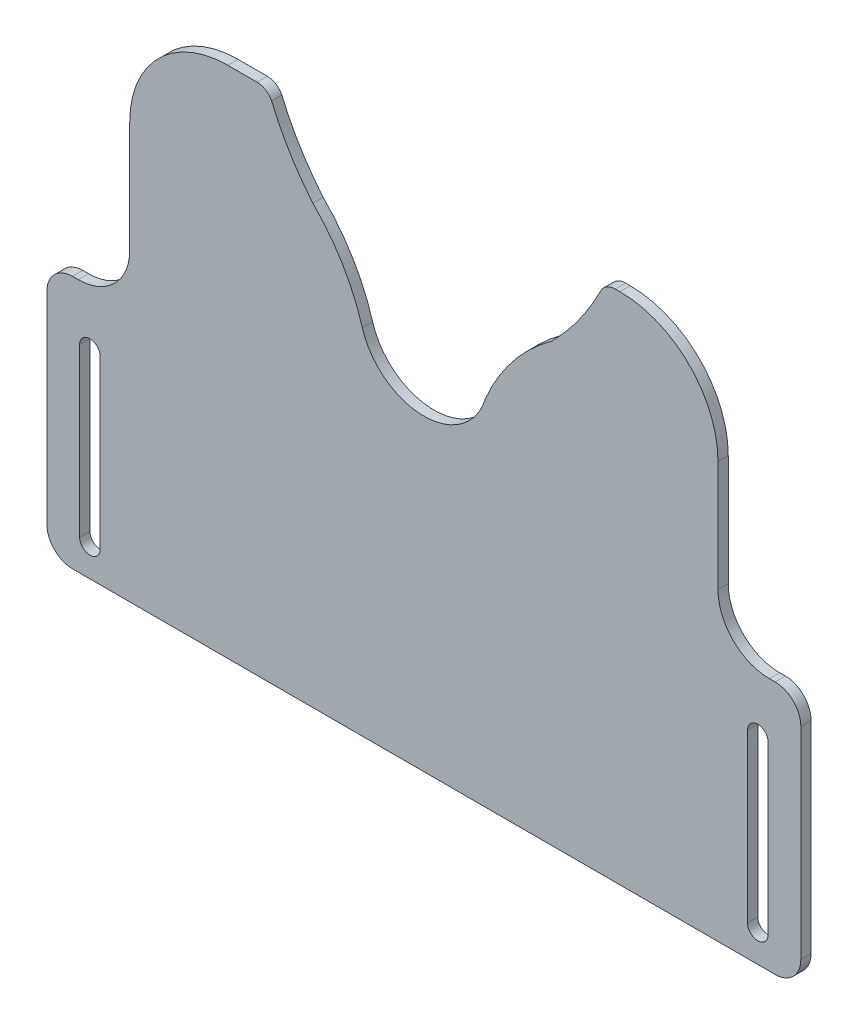
ISO-10303-21;
HEADER;
FILE_DESCRIPTION(('STEP AP214'),'2;1');
FILE_NAME('part.step','',(''),(''),'','','');
FILE_SCHEMA(('AUTOMOTIVE_DESIGN { 1 0 10303 214 1 1 1 1 }'));
ENDSEC;
DATA;
#1=APPLICATION_CONTEXT('core data for automotive mechanical design processes');
#2=APPLICATION_PROTOCOL_DEFINITION('international standard','automotive_design',2000,#1);
#3=PRODUCT_CONTEXT('',#1,'mechanical');
#4=PRODUCT('Part','Part','',(#3));
#5=PRODUCT_RELATED_PRODUCT_CATEGORY('part','',(#4));
#6=PRODUCT_DEFINITION_FORMATION('','',#4);
#7=PRODUCT_DEFINITION_CONTEXT('part definition',#1,'design');
#8=PRODUCT_DEFINITION('design','',#6,#7);
#9=PRODUCT_DEFINITION_SHAPE('','',#8);
#10=(LENGTH_UNIT() NAMED_UNIT(*) SI_UNIT(.MILLI.,.METRE.));
#11=(NAMED_UNIT(*) PLANE_ANGLE_UNIT() SI_UNIT($,.RADIAN.));
#12=(NAMED_UNIT(*) SI_UNIT($,.STERADIAN.) SOLID_ANGLE_UNIT());
#13=UNCERTAINTY_MEASURE_WITH_UNIT(LENGTH_MEASURE(1.E-05),#10,'distance_accuracy_value','');
#14=(GEOMETRIC_REPRESENTATION_CONTEXT(3) GLOBAL_UNCERTAINTY_ASSIGNED_CONTEXT((#13)) GLOBAL_UNIT_ASSIGNED_CONTEXT((#10,
#11,#12)) REPRESENTATION_CONTEXT('',''));
#15=CARTESIAN_POINT('',(0.,0.,0.));
#16=DIRECTION('',(0.,0.,1.));
#17=DIRECTION('',(1.,0.,0.));
#18=AXIS2_PLACEMENT_3D('',#15,#16,#17);
#19=CARTESIAN_POINT('',(76.3333289832106,155.198889476935,4.));
#20=DIRECTION('',(0.,0.,-1.));
#21=DIRECTION('',(-1.,0.,0.));
#22=AXIS2_PLACEMENT_3D('',#19,#20,#21);
#23=CYLINDRICAL_SURFACE('',#22,38.1666666666667);
#24=CARTESIAN_POINT('',(76.3333289832106,155.198889476935,0.));
#25=DIRECTION('',(0.,0.,1.));
#26=DIRECTION('',(1.,0.,0.));
#27=AXIS2_PLACEMENT_3D('',#24,#25,#26);
#28=CIRCLE('',#27,38.1666666666667);
#29=CARTESIAN_POINT('',(114.499995649877,155.198890546497,0.));
#30=VERTEX_POINT('',#29);
#31=CARTESIAN_POINT('',(76.3333272525749,193.365556143602,0.));
#32=VERTEX_POINT('',#31);
#33=EDGE_CURVE('E348',#30,#32,#28,.T.);
#34=ORIENTED_EDGE('',*,*,#33,.T.);
#35=DIRECTION('',(0.,0.,-1.));
#36=VECTOR('',#35,1.);
#37=CARTESIAN_POINT('',(76.3333272525749,193.365556143602,4.));
#38=LINE('',#37,#36);
#39=CARTESIAN_POINT('',(76.3333272525749,193.365556143602,4.));
#40=VERTEX_POINT('',#39);
#41=EDGE_CURVE('E411',#40,#32,#38,.T.);
#42=ORIENTED_EDGE('',*,*,#41,.F.);
#43=CARTESIAN_POINT('',(76.3333289832106,155.198889476935,4.));
#44=DIRECTION('',(0.,0.,1.));
#45=DIRECTION('',(1.,0.,0.));
#46=AXIS2_PLACEMENT_3D('',#43,#44,#45);
#47=CIRCLE('',#46,38.1666666666667);
#48=CARTESIAN_POINT('',(114.499995649877,155.198890546497,4.));
#49=VERTEX_POINT('',#48);
#50=EDGE_CURVE('E475',#49,#40,#47,.T.);
#51=ORIENTED_EDGE('',*,*,#50,.F.);
#52=DIRECTION('',(0.,0.,-1.));
#53=VECTOR('',#52,1.);
#54=CARTESIAN_POINT('',(114.499995649877,155.198890546497,4.));
#55=LINE('',#54,#53);
#56=EDGE_CURVE('E339',#49,#30,#55,.T.);
#57=ORIENTED_EDGE('',*,*,#56,.T.);
#58=EDGE_LOOP('',(#34,#42,#51,#57));
#59=FACE_BOUND('',#58,.T.);
#60=ADVANCED_FACE('F36',(#59),#23,.T.);
#61=CARTESIAN_POINT('',(76.3333272525749,193.365556143602,4.));
#62=DIRECTION('',(0.,-1.,0.));
#63=DIRECTION('',(0.,0.,-1.));
#64=AXIS2_PLACEMENT_3D('',#61,#62,#63);
#65=PLANE('',#64);
#66=DIRECTION('',(-1.,0.,0.));
#67=VECTOR('',#66,1.);
#68=CARTESIAN_POINT('',(76.3333272525749,193.365556143602,0.));
#69=LINE('',#68,#67);
#70=CARTESIAN_POINT('',(74.5052506463805,193.365556143602,0.));
#71=VERTEX_POINT('',#70);
#72=EDGE_CURVE('E351',#32,#71,#69,.T.);
#73=ORIENTED_EDGE('',*,*,#72,.T.);
#74=DIRECTION('',(0.,0.,-1.));
#75=VECTOR('',#74,1.);
#76=CARTESIAN_POINT('',(74.5052506463805,193.365556143602,4.));
#77=LINE('',#76,#75);
#78=CARTESIAN_POINT('',(74.5052506463805,193.365556143602,4.));
#79=VERTEX_POINT('',#78);
#80=EDGE_CURVE('E408',#79,#71,#77,.T.);
#81=ORIENTED_EDGE('',*,*,#80,.F.);
#82=DIRECTION('',(-1.,0.,0.));
#83=VECTOR('',#82,1.);
#84=CARTESIAN_POINT('',(76.3333272525749,193.365556143602,4.));
#85=LINE('',#84,#83);
#86=EDGE_CURVE('E478',#40,#79,#85,.T.);
#87=ORIENTED_EDGE('',*,*,#86,.F.);
#88=ORIENTED_EDGE('',*,*,#41,.T.);
#89=EDGE_LOOP('',(#73,#81,#87,#88));
#90=FACE_BOUND('',#89,.T.);
#91=ADVANCED_FACE('F531',(#90),#65,.F.);
#92=CARTESIAN_POINT('',(74.5052506463805,187.004445032491,4.));
#93=DIRECTION('',(0.,0.,-1.));
#94=DIRECTION('',(-1.,0.,0.));
#95=AXIS2_PLACEMENT_3D('',#92,#93,#94);
#96=CYLINDRICAL_SURFACE('',#95,6.36111111111113);
#97=CARTESIAN_POINT('',(74.5052506463805,187.004445032491,0.));
#98=DIRECTION('',(0.,0.,1.));
#99=DIRECTION('',(1.,0.,0.));
#100=AXIS2_PLACEMENT_3D('',#97,#98,#99);
#101=CIRCLE('',#100,6.36111111111113);
#102=CARTESIAN_POINT('',(68.8157016929044,189.849223982409,0.));
#103=VERTEX_POINT('',#102);
#104=EDGE_CURVE('E354',#71,#103,#101,.T.);
#105=ORIENTED_EDGE('',*,*,#104,.T.);
#106=DIRECTION('',(0.,0.,-1.));
#107=VECTOR('',#106,1.);
#108=CARTESIAN_POINT('',(68.8157016929044,189.849223982409,4.));
#109=LINE('',#108,#107);
#110=CARTESIAN_POINT('',(68.8157016929044,189.849223982409,4.));
#111=VERTEX_POINT('',#110);
#112=EDGE_CURVE('E405',#111,#103,#109,.T.);
#113=ORIENTED_EDGE('',*,*,#112,.F.);
#114=CARTESIAN_POINT('',(74.5052506463805,187.004445032491,4.));
#115=DIRECTION('',(0.,0.,1.));
#116=DIRECTION('',(1.,0.,0.));
#117=AXIS2_PLACEMENT_3D('',#114,#115,#116);
#118=CIRCLE('',#117,6.36111111111113);
#119=EDGE_CURVE('E480',#79,#111,#118,.T.);
#120=ORIENTED_EDGE('',*,*,#119,.F.);
#121=ORIENTED_EDGE('',*,*,#80,.T.);
#122=EDGE_LOOP('',(#105,#113,#120,#121));
#123=FACE_BOUND('',#122,.T.);
#124=ADVANCED_FACE('F537',(#123),#96,.T.);
#125=CARTESIAN_POINT('',(-22.2170815627129,235.365687181111,4.));
#126=DIRECTION('',(0.,0.,-1.));
#127=DIRECTION('',(-1.,0.,0.));
#128=AXIS2_PLACEMENT_3D('',#125,#126,#127);
#129=CYLINDRICAL_SURFACE('',#128,101.777777777779);
#130=CARTESIAN_POINT('',(-22.2170815627129,235.365687181111,0.));
#131=DIRECTION('',(0.,0.,-1.));
#132=DIRECTION('',(1.,0.,0.));
#133=AXIS2_PLACEMENT_3D('',#130,#131,#132);
#134=CIRCLE('',#133,101.777777777779);
#135=CARTESIAN_POINT('',(49.7506752780528,163.397930340347,0.));
#136=VERTEX_POINT('',#135);
#137=EDGE_CURVE('E356',#103,#136,#134,.T.);
#138=ORIENTED_EDGE('',*,*,#137,.T.);
#139=DIRECTION('',(0.,0.,-1.));
#140=VECTOR('',#139,1.);
#141=CARTESIAN_POINT('',(49.7506752780528,163.397930340347,4.));
#142=LINE('',#141,#140);
#143=CARTESIAN_POINT('',(49.7506752780528,163.397930340347,4.));
#144=VERTEX_POINT('',#143);
#145=EDGE_CURVE('E402',#144,#136,#142,.T.);
#146=ORIENTED_EDGE('',*,*,#145,.F.);
#147=CARTESIAN_POINT('',(-22.2170815627129,235.365687181111,4.));
#148=DIRECTION('',(0.,0.,-1.));
#149=DIRECTION('',(1.,0.,0.));
#150=AXIS2_PLACEMENT_3D('',#147,#148,#149);
#151=CIRCLE('',#150,101.777777777779);
#152=EDGE_CURVE('E482',#111,#144,#151,.T.);
#153=ORIENTED_EDGE('',*,*,#152,.F.);
#154=ORIENTED_EDGE('',*,*,#112,.T.);
#155=EDGE_LOOP('',(#138,#146,#153,#154));
#156=FACE_BOUND('',#155,.T.);
#157=ADVANCED_FACE('F571',(#156),#129,.F.);
#158=CARTESIAN_POINT('',(94.2687294725971,101.390506361363,4.));
#159=DIRECTION('',(0.,0.,-1.));
#160=DIRECTION('',(-1.,0.,0.));
#161=AXIS2_PLACEMENT_3D('',#158,#159,#160);
#162=CYLINDRICAL_SURFACE('',#161,76.3333333333336);
#163=CARTESIAN_POINT('',(94.2687294725971,101.390506361363,0.));
#164=DIRECTION('',(0.,0.,1.));
#165=DIRECTION('',(1.,0.,0.));
#166=AXIS2_PLACEMENT_3D('',#163,#164,#165);
#167=CIRCLE('',#166,76.3333333333336);
#168=CARTESIAN_POINT('',(23.967616463288,131.131577078978,0.));
#169=VERTEX_POINT('',#168);
#170=EDGE_CURVE('E358',#136,#169,#167,.T.);
#171=ORIENTED_EDGE('',*,*,#170,.T.);
#172=DIRECTION('',(0.,0.,-1.));
#173=VECTOR('',#172,1.);
#174=CARTESIAN_POINT('',(23.967616463288,131.131577078978,4.));
#175=LINE('',#174,#173);
#176=CARTESIAN_POINT('',(23.967616463288,131.131577078978,4.));
#177=VERTEX_POINT('',#176);
#178=EDGE_CURVE('E399',#177,#169,#175,.T.);
#179=ORIENTED_EDGE('',*,*,#178,.F.);
#180=CARTESIAN_POINT('',(94.2687294725971,101.390506361363,4.));
#181=DIRECTION('',(0.,0.,1.));
#182=DIRECTION('',(1.,0.,0.));
#183=AXIS2_PLACEMENT_3D('',#180,#181,#182);
#184=CIRCLE('',#183,76.3333333333336);
#185=EDGE_CURVE('E484',#144,#177,#184,.T.);
#186=ORIENTED_EDGE('',*,*,#185,.F.);
#187=ORIENTED_EDGE('',*,*,#145,.T.);
#188=EDGE_LOOP('',(#171,#179,#186,#187));
#189=FACE_BOUND('',#188,.T.);
#190=ADVANCED_FACE('F577',(#189),#162,.T.);
#191=CARTESIAN_POINT('',(-1.21616577122813E-06,138.241661661564,4.));
#192=DIRECTION('',(0.,0.,-1.));
#193=DIRECTION('',(-1.,0.,0.));
#194=AXIS2_PLACEMENT_3D('',#191,#192,#193);
#195=CYLINDRICAL_SURFACE('',#194,25.);
#196=CARTESIAN_POINT('',(-1.21616577122813E-06,138.241661661564,0.));
#197=DIRECTION('',(0.,0.,-1.));
#198=DIRECTION('',(1.,0.,0.));
#199=AXIS2_PLACEMENT_3D('',#196,#197,#198);
#200=CIRCLE('',#199,25.);
#201=CARTESIAN_POINT('',(-23.9676183692534,131.131575304633,0.));
#202=VERTEX_POINT('',#201);
#203=EDGE_CURVE('E360',#169,#202,#200,.T.);
#204=ORIENTED_EDGE('',*,*,#203,.T.);
#205=DIRECTION('',(0.,0.,-1.));
#206=VECTOR('',#205,1.);
#207=CARTESIAN_POINT('',(-23.9676183692534,131.131575304633,4.));
#208=LINE('',#207,#206);
#209=CARTESIAN_POINT('',(-23.9676183692534,131.131575304633,4.));
#210=VERTEX_POINT('',#209);
#211=EDGE_CURVE('E396',#210,#202,#208,.T.);
#212=ORIENTED_EDGE('',*,*,#211,.F.);
#213=CARTESIAN_POINT('',(-1.21616577122813E-06,138.241661661564,4.));
#214=DIRECTION('',(0.,0.,-1.));
#215=DIRECTION('',(1.,0.,0.));
#216=AXIS2_PLACEMENT_3D('',#213,#214,#215);
#217=CIRCLE('',#216,25.);
#218=EDGE_CURVE('E486',#177,#210,#217,.T.);
#219=ORIENTED_EDGE('',*,*,#218,.F.);
#220=ORIENTED_EDGE('',*,*,#178,.T.);
#221=EDGE_LOOP('',(#204,#212,#219,#220));
#222=FACE_BOUND('',#221,.T.);
#223=ADVANCED_FACE('F581',(#222),#195,.F.);
#224=CARTESIAN_POINT('',(-97.1487427433478,109.422111628136,4.));
#225=DIRECTION('',(0.,0.,-1.));
#226=DIRECTION('',(-1.,0.,0.));
#227=AXIS2_PLACEMENT_3D('',#224,#225,#226);
#228=CYLINDRICAL_SURFACE('',#227,76.3333333333336);
#229=CARTESIAN_POINT('',(-97.1487427433478,109.422111628136,0.));
#230=DIRECTION('',(0.,0.,1.));
#231=DIRECTION('',(1.,0.,0.));
#232=AXIS2_PLACEMENT_3D('',#229,#230,#231);
#233=CIRCLE('',#232,76.3333333333336);
#234=CARTESIAN_POINT('',(-43.1729271107142,163.397931256649,0.));
#235=VERTEX_POINT('',#234);
#236=EDGE_CURVE('E362',#202,#235,#233,.T.);
#237=ORIENTED_EDGE('',*,*,#236,.T.);
#238=DIRECTION('',(0.,0.,-1.));
#239=VECTOR('',#238,1.);
#240=CARTESIAN_POINT('',(-43.1729271107142,163.397931256649,4.));
#241=LINE('',#240,#239);
#242=CARTESIAN_POINT('',(-43.1729271107142,163.397931256649,4.));
#243=VERTEX_POINT('',#242);
#244=EDGE_CURVE('E393',#243,#235,#241,.T.);
#245=ORIENTED_EDGE('',*,*,#244,.F.);
#246=CARTESIAN_POINT('',(-97.1487427433478,109.422111628136,4.));
#247=DIRECTION('',(0.,0.,1.));
#248=DIRECTION('',(1.,0.,0.));
#249=AXIS2_PLACEMENT_3D('',#246,#247,#248);
#250=CIRCLE('',#249,76.3333333333336);
#251=EDGE_CURVE('E488',#210,#243,#250,.T.);
#252=ORIENTED_EDGE('',*,*,#251,.F.);
#253=ORIENTED_EDGE('',*,*,#211,.T.);
#254=EDGE_LOOP('',(#237,#245,#252,#253));
#255=FACE_BOUND('',#254,.T.);
#256=ADVANCED_FACE('F586',(#255),#228,.T.);
#257=CARTESIAN_POINT('',(34.7025770998733,228.927481028713,4.));
#258=DIRECTION('',(0.,0.,-1.));
#259=DIRECTION('',(-1.,0.,0.));
#260=AXIS2_PLACEMENT_3D('',#257,#258,#259);
#261=CYLINDRICAL_SURFACE('',#260,101.777777777777);
#262=CARTESIAN_POINT('',(34.7025770998733,228.927481028713,0.));
#263=DIRECTION('',(0.,0.,-1.));
#264=DIRECTION('',(1.,0.,0.));
#265=AXIS2_PLACEMENT_3D('',#262,#263,#264);
#266=CIRCLE('',#265,101.777777777777);
#267=CARTESIAN_POINT('',(-59.2740470790445,189.849224193011,0.));
#268=VERTEX_POINT('',#267);
#269=EDGE_CURVE('E364',#235,#268,#266,.T.);
#270=ORIENTED_EDGE('',*,*,#269,.T.);
#271=DIRECTION('',(0.,0.,-1.));
#272=VECTOR('',#271,1.);
#273=CARTESIAN_POINT('',(-59.2740470790445,189.849224193011,4.));
#274=LINE('',#273,#272);
#275=CARTESIAN_POINT('',(-59.2740470790445,189.849224193011,4.));
#276=VERTEX_POINT('',#275);
#277=EDGE_CURVE('E390',#276,#268,#274,.T.);
#278=ORIENTED_EDGE('',*,*,#277,.F.);
#279=CARTESIAN_POINT('',(34.7025770998733,228.927481028713,4.));
#280=DIRECTION('',(0.,0.,-1.));
#281=DIRECTION('',(1.,0.,0.));
#282=AXIS2_PLACEMENT_3D('',#279,#280,#281);
#283=CIRCLE('',#282,101.777777777777);
#284=EDGE_CURVE('E490',#243,#276,#283,.T.);
#285=ORIENTED_EDGE('',*,*,#284,.F.);
#286=ORIENTED_EDGE('',*,*,#244,.T.);
#287=EDGE_LOOP('',(#270,#278,#285,#286));
#288=FACE_BOUND('',#287,.T.);
#289=ADVANCED_FACE('F592',(#288),#261,.F.);
#290=CARTESIAN_POINT('',(-64.9635959272196,187.004445032491,4.));
#291=DIRECTION('',(0.,0.,-1.));
#292=DIRECTION('',(-1.,0.,0.));
#293=AXIS2_PLACEMENT_3D('',#290,#291,#292);
#294=CYLINDRICAL_SURFACE('',#293,6.36111111111103);
#295=CARTESIAN_POINT('',(-64.9635959272196,187.004445032491,0.));
#296=DIRECTION('',(0.,0.,1.));
#297=DIRECTION('',(1.,0.,0.));
#298=AXIS2_PLACEMENT_3D('',#295,#296,#297);
#299=CIRCLE('',#298,6.36111111111103);
#300=CARTESIAN_POINT('',(-64.9635959272196,193.365556143602,0.));
#301=VERTEX_POINT('',#300);
#302=EDGE_CURVE('E366',#268,#301,#299,.T.);
#303=ORIENTED_EDGE('',*,*,#302,.T.);
#304=DIRECTION('',(0.,0.,-1.));
#305=VECTOR('',#304,1.);
#306=CARTESIAN_POINT('',(-64.9635959272196,193.365556143602,4.));
#307=LINE('',#306,#305);
#308=CARTESIAN_POINT('',(-64.9635959272196,193.365556143602,4.));
#309=VERTEX_POINT('',#308);
#310=EDGE_CURVE('E387',#309,#301,#307,.T.);
#311=ORIENTED_EDGE('',*,*,#310,.F.);
#312=CARTESIAN_POINT('',(-64.9635959272196,187.004445032491,4.));
#313=DIRECTION('',(0.,0.,1.));
#314=DIRECTION('',(1.,0.,0.));
#315=AXIS2_PLACEMENT_3D('',#312,#313,#314);
#316=CIRCLE('',#315,6.36111111111103);
#317=EDGE_CURVE('E492',#276,#309,#316,.T.);
#318=ORIENTED_EDGE('',*,*,#317,.F.);
#319=ORIENTED_EDGE('',*,*,#277,.T.);
#320=EDGE_LOOP('',(#303,#311,#318,#319));
#321=FACE_BOUND('',#320,.T.);
#322=ADVANCED_FACE('F596',(#321),#294,.T.);
#323=CARTESIAN_POINT('',(-64.9635959272196,193.365556143602,4.));
#324=DIRECTION('',(0.,-1.,0.));
#325=DIRECTION('',(0.,0.,-1.));
#326=AXIS2_PLACEMENT_3D('',#323,#324,#325);
#327=PLANE('',#326);
#328=DIRECTION('',(-1.,0.,0.));
#329=VECTOR('',#328,1.);
#330=CARTESIAN_POINT('',(-64.9635959272196,193.365556143602,0.));
#331=LINE('',#330,#329);
#332=CARTESIAN_POINT('',(-76.3333380227836,193.365556143602,0.));
#333=VERTEX_POINT('',#332);
#334=EDGE_CURVE('E368',#301,#333,#331,.T.);
#335=ORIENTED_EDGE('',*,*,#334,.T.);
#336=DIRECTION('',(0.,0.,-1.));
#337=VECTOR('',#336,1.);
#338=CARTESIAN_POINT('',(-76.3333380227836,193.365556143602,4.));
#339=LINE('',#338,#337);
#340=CARTESIAN_POINT('',(-76.3333380227836,193.365556143602,4.));
#341=VERTEX_POINT('',#340);
#342=EDGE_CURVE('E384',#341,#333,#339,.T.);
#343=ORIENTED_EDGE('',*,*,#342,.F.);
#344=DIRECTION('',(-1.,0.,0.));
#345=VECTOR('',#344,1.);
#346=CARTESIAN_POINT('',(-64.9635959272196,193.365556143602,4.));
#347=LINE('',#346,#345);
#348=EDGE_CURVE('E494',#309,#341,#347,.T.);
#349=ORIENTED_EDGE('',*,*,#348,.F.);
#350=ORIENTED_EDGE('',*,*,#310,.T.);
#351=EDGE_LOOP('',(#335,#343,#349,#350));
#352=FACE_BOUND('',#351,.T.);
#353=ADVANCED_FACE('F601',(#352),#327,.F.);
#354=CARTESIAN_POINT('',(-76.3333376881644,155.198889476935,4.));
#355=DIRECTION('',(0.,0.,-1.));
#356=DIRECTION('',(-1.,0.,0.));
#357=AXIS2_PLACEMENT_3D('',#354,#355,#356);
#358=CYLINDRICAL_SURFACE('',#357,38.1666666666666);
#359=CARTESIAN_POINT('',(-76.3333376881644,155.198889476935,0.));
#360=DIRECTION('',(0.,0.,1.));
#361=DIRECTION('',(1.,0.,0.));
#362=AXIS2_PLACEMENT_3D('',#359,#360,#361);
#363=CIRCLE('',#362,38.1666666666666);
#364=CARTESIAN_POINT('',(-114.500004354831,155.198888405766,0.));
#365=VERTEX_POINT('',#364);
#366=EDGE_CURVE('E370',#333,#365,#363,.T.);
#367=ORIENTED_EDGE('',*,*,#366,.T.);
#368=DIRECTION('',(0.,0.,-1.));
#369=VECTOR('',#368,1.);
#370=CARTESIAN_POINT('',(-114.500004354831,155.198888405766,4.));
#371=LINE('',#370,#369);
#372=CARTESIAN_POINT('',(-114.500004354831,155.198888405766,4.));
#373=VERTEX_POINT('',#372);
#374=EDGE_CURVE('E381',#373,#365,#371,.T.);
#375=ORIENTED_EDGE('',*,*,#374,.F.);
#376=CARTESIAN_POINT('',(-76.3333376881644,155.198889476935,4.));
#377=DIRECTION('',(0.,0.,1.));
#378=DIRECTION('',(1.,0.,0.));
#379=AXIS2_PLACEMENT_3D('',#376,#377,#378);
#380=CIRCLE('',#379,38.1666666666666);
#381=EDGE_CURVE('E496',#341,#373,#380,.T.);
#382=ORIENTED_EDGE('',*,*,#381,.F.);
#383=ORIENTED_EDGE('',*,*,#342,.T.);
#384=EDGE_LOOP('',(#367,#375,#382,#383));
#385=FACE_BOUND('',#384,.T.);
#386=ADVANCED_FACE('F605',(#385),#358,.T.);
#387=CARTESIAN_POINT('',(-114.500004354831,155.198888405766,4.));
#388=DIRECTION('',(1.,0.,0.));
#389=DIRECTION('',(0.,1.,0.));
#390=AXIS2_PLACEMENT_3D('',#387,#388,#389);
#391=PLANE('',#390);
#392=DIRECTION('',(0.,-1.,0.));
#393=VECTOR('',#392,1.);
#394=CARTESIAN_POINT('',(-114.500004354831,155.198888405766,0.));
#395=LINE('',#394,#393);
#396=CARTESIAN_POINT('',(-114.500004354831,112.,0.));
#397=VERTEX_POINT('',#396);
#398=EDGE_CURVE('E372',#365,#397,#395,.T.);
#399=ORIENTED_EDGE('',*,*,#398,.T.);
#400=DIRECTION('',(0.,0.,1.));
#401=VECTOR('',#400,1.);
#402=CARTESIAN_POINT('',(-114.500004354831,112.,4.));
#403=LINE('',#402,#401);
#404=CARTESIAN_POINT('',(-114.500004354831,112.,4.));
#405=VERTEX_POINT('',#404);
#406=EDGE_CURVE('E328',#397,#405,#403,.T.);
#407=ORIENTED_EDGE('',*,*,#406,.T.);
#408=DIRECTION('',(0.,-1.,0.));
#409=VECTOR('',#408,1.);
#410=CARTESIAN_POINT('',(-114.500004354831,155.198888405766,4.));
#411=LINE('',#410,#409);
#412=EDGE_CURVE('E497',#373,#405,#411,.T.);
#413=ORIENTED_EDGE('',*,*,#412,.F.);
#414=ORIENTED_EDGE('',*,*,#374,.T.);
#415=EDGE_LOOP('',(#399,#407,#413,#414));
#416=FACE_BOUND('',#415,.T.);
#417=ADVANCED_FACE('F608',(#416),#391,.F.);
#418=CARTESIAN_POINT('',(-114.500004354831,-6.63444385639828,4.));
#419=DIRECTION('',(0.,1.,0.));
#420=DIRECTION('',(-1.,0.,0.));
#421=AXIS2_PLACEMENT_3D('',#418,#419,#420);
#422=PLANE('',#421);
#423=DIRECTION('',(1.,0.,0.));
#424=VECTOR('',#423,1.);
#425=CARTESIAN_POINT('',(-114.500004354831,-6.63444385639828,0.));
#426=LINE('',#425,#424);
#427=CARTESIAN_POINT('',(-136.747353152999,-6.63444385639828,0.));
#428=VERTEX_POINT('',#427);
#429=CARTESIAN_POINT('',(136.747353152999,-6.63444385639826,0.));
#430=VERTEX_POINT('',#429);
#431=EDGE_CURVE('E375',#428,#430,#426,.T.);
#432=ORIENTED_EDGE('',*,*,#431,.T.);
#433=DIRECTION('',(0.,0.,1.));
#434=VECTOR('',#433,1.);
#435=CARTESIAN_POINT('',(136.747353152999,-6.63444385639826,4.));
#436=LINE('',#435,#434);
#437=CARTESIAN_POINT('',(136.747353152999,-6.63444385639826,4.));
#438=VERTEX_POINT('',#437);
#439=EDGE_CURVE('E317',#430,#438,#436,.T.);
#440=ORIENTED_EDGE('',*,*,#439,.T.);
#441=DIRECTION('',(1.,0.,0.));
#442=VECTOR('',#441,1.);
#443=CARTESIAN_POINT('',(-114.500004354831,-6.63444385639828,4.));
#444=LINE('',#443,#442);
#445=CARTESIAN_POINT('',(-136.747353152999,-6.63444385639828,4.));
#446=VERTEX_POINT('',#445);
#447=EDGE_CURVE('E340',#446,#438,#444,.T.);
#448=ORIENTED_EDGE('',*,*,#447,.F.);
#449=DIRECTION('',(0.,0.,1.));
#450=VECTOR('',#449,1.);
#451=CARTESIAN_POINT('',(-136.747353152999,-6.63444385639828,0.));
#452=LINE('',#451,#450);
#453=EDGE_CURVE('E315',#446,#428,#452,.F.);
#454=ORIENTED_EDGE('',*,*,#453,.T.);
#455=EDGE_LOOP('',(#432,#440,#448,#454));
#456=FACE_BOUND('',#455,.T.);
#457=ADVANCED_FACE('F451',(#456),#422,.F.);
#458=CARTESIAN_POINT('',(114.499995649877,-6.63444385639826,4.));
#459=DIRECTION('',(-1.,0.,0.));
#460=DIRECTION('',(0.,-1.,0.));
#461=AXIS2_PLACEMENT_3D('',#458,#459,#460);
#462=PLANE('',#461);
#463=DIRECTION('',(0.,1.,0.));
#464=VECTOR('',#463,1.);
#465=CARTESIAN_POINT('',(114.499995649877,-6.63444385639826,4.));
#466=LINE('',#465,#464);
#467=CARTESIAN_POINT('',(114.499995649877,112.,4.));
#468=VERTEX_POINT('',#467);
#469=EDGE_CURVE('E336',#468,#49,#466,.T.);
#470=ORIENTED_EDGE('',*,*,#469,.F.);
#471=DIRECTION('',(0.,0.,1.));
#472=VECTOR('',#471,1.);
#473=CARTESIAN_POINT('',(114.499995649877,112.,4.));
#474=LINE('',#473,#472);
#475=CARTESIAN_POINT('',(114.499995649877,112.,0.));
#476=VERTEX_POINT('',#475);
#477=EDGE_CURVE('E51',#468,#476,#474,.F.);
#478=ORIENTED_EDGE('',*,*,#477,.T.);
#479=DIRECTION('',(0.,1.,0.));
#480=VECTOR('',#479,1.);
#481=CARTESIAN_POINT('',(114.499995649877,-6.63444385639826,0.));
#482=LINE('',#481,#480);
#483=EDGE_CURVE('E341',#476,#30,#482,.T.);
#484=ORIENTED_EDGE('',*,*,#483,.T.);
#485=ORIENTED_EDGE('',*,*,#56,.F.);
#486=EDGE_LOOP('',(#470,#478,#484,#485));
#487=FACE_BOUND('',#486,.T.);
#488=ADVANCED_FACE('F559',(#487),#462,.F.);
#489=CARTESIAN_POINT('',(76.3333289832106,155.198889476935,4.));
#490=DIRECTION('',(0.,0.,1.));
#491=DIRECTION('',(1.,0.,0.));
#492=AXIS2_PLACEMENT_3D('',#489,#490,#491);
#493=PLANE('',#492);
#494=DIRECTION('',(0.,1.,0.));
#495=VECTOR('',#494,1.);
#496=CARTESIAN_POINT('',(146.747353152999,-6.63444385639828,4.));
#497=LINE('',#496,#495);
#498=CARTESIAN_POINT('',(146.747353152999,3.36555614360174,4.));
#499=VERTEX_POINT('',#498);
#500=CARTESIAN_POINT('',(146.747353152999,82.,4.));
#501=VERTEX_POINT('',#500);
#502=EDGE_CURVE('E291',#499,#501,#497,.T.);
#503=ORIENTED_EDGE('',*,*,#502,.T.);
#504=CARTESIAN_POINT('',(136.747353152999,82.,4.));
#505=DIRECTION('',(0.,0.,1.));
#506=DIRECTION('',(1.,0.,0.));
#507=AXIS2_PLACEMENT_3D('',#504,#505,#506);
#508=CIRCLE('',#507,10.);
#509=CARTESIAN_POINT('',(136.747353152999,92.,4.));
#510=VERTEX_POINT('',#509);
#511=EDGE_CURVE('E302',#501,#510,#508,.T.);
#512=ORIENTED_EDGE('',*,*,#511,.T.);
#513=DIRECTION('',(-1.,0.,0.));
#514=VECTOR('',#513,1.);
#515=CARTESIAN_POINT('',(146.747353152999,92.,4.));
#516=LINE('',#515,#514);
#517=CARTESIAN_POINT('',(134.499995649877,92.,4.));
#518=VERTEX_POINT('',#517);
#519=EDGE_CURVE('E282',#510,#518,#516,.T.);
#520=ORIENTED_EDGE('',*,*,#519,.T.);
#521=CARTESIAN_POINT('',(134.499995649877,112.,4.));
#522=DIRECTION('',(0.,0.,1.));
#523=DIRECTION('',(1.,0.,0.));
#524=AXIS2_PLACEMENT_3D('',#521,#522,#523);
#525=CIRCLE('',#524,20.);
#526=EDGE_CURVE('E44',#518,#468,#525,.F.);
#527=ORIENTED_EDGE('',*,*,#526,.T.);
#528=ORIENTED_EDGE('',*,*,#469,.T.);
#529=ORIENTED_EDGE('',*,*,#50,.T.);
#530=ORIENTED_EDGE('',*,*,#86,.T.);
#531=ORIENTED_EDGE('',*,*,#119,.T.);
#532=ORIENTED_EDGE('',*,*,#152,.T.);
#533=ORIENTED_EDGE('',*,*,#185,.T.);
#534=ORIENTED_EDGE('',*,*,#218,.T.);
#535=ORIENTED_EDGE('',*,*,#251,.T.);
#536=ORIENTED_EDGE('',*,*,#284,.T.);
#537=ORIENTED_EDGE('',*,*,#317,.T.);
#538=ORIENTED_EDGE('',*,*,#348,.T.);
#539=ORIENTED_EDGE('',*,*,#381,.T.);
#540=ORIENTED_EDGE('',*,*,#412,.T.);
#541=CARTESIAN_POINT('',(-134.500004354831,112.,4.));
#542=DIRECTION('',(0.,0.,1.));
#543=DIRECTION('',(1.,0.,0.));
#544=AXIS2_PLACEMENT_3D('',#541,#542,#543);
#545=CIRCLE('',#544,20.);
#546=CARTESIAN_POINT('',(-134.500004354831,92.,4.));
#547=VERTEX_POINT('',#546);
#548=EDGE_CURVE('E513',#405,#547,#545,.F.);
#549=ORIENTED_EDGE('',*,*,#548,.T.);
#550=DIRECTION('',(-1.,0.,0.));
#551=VECTOR('',#550,1.);
#552=CARTESIAN_POINT('',(-146.747353152999,92.,4.));
#553=LINE('',#552,#551);
#554=CARTESIAN_POINT('',(-136.747353152999,92.,4.));
#555=VERTEX_POINT('',#554);
#556=EDGE_CURVE('E471',#547,#555,#553,.T.);
#557=ORIENTED_EDGE('',*,*,#556,.T.);
#558=CARTESIAN_POINT('',(-136.747353152999,82.,4.));
#559=DIRECTION('',(0.,0.,1.));
#560=DIRECTION('',(1.,0.,0.));
#561=AXIS2_PLACEMENT_3D('',#558,#559,#560);
#562=CIRCLE('',#561,10.);
#563=CARTESIAN_POINT('',(-146.747353152999,82.,4.));
#564=VERTEX_POINT('',#563);
#565=EDGE_CURVE('E419',#555,#564,#562,.T.);
#566=ORIENTED_EDGE('',*,*,#565,.T.);
#567=DIRECTION('',(0.,-1.,0.));
#568=VECTOR('',#567,1.);
#569=CARTESIAN_POINT('',(-146.747353152999,-6.63444385639828,4.));
#570=LINE('',#569,#568);
#571=CARTESIAN_POINT('',(-146.747353152999,3.36555614360172,4.));
#572=VERTEX_POINT('',#571);
#573=EDGE_CURVE('E467',#564,#572,#570,.T.);
#574=ORIENTED_EDGE('',*,*,#573,.T.);
#575=CARTESIAN_POINT('',(-136.747353152999,3.36555614360172,4.));
#576=DIRECTION('',(0.,0.,1.));
#577=DIRECTION('',(1.,0.,0.));
#578=AXIS2_PLACEMENT_3D('',#575,#576,#577);
#579=CIRCLE('',#578,10.);
#580=EDGE_CURVE('E422',#572,#446,#579,.T.);
#581=ORIENTED_EDGE('',*,*,#580,.T.);
#582=ORIENTED_EDGE('',*,*,#447,.T.);
#583=CARTESIAN_POINT('',(136.747353152999,3.36555614360174,4.));
#584=DIRECTION('',(0.,0.,1.));
#585=DIRECTION('',(1.,0.,0.));
#586=AXIS2_PLACEMENT_3D('',#583,#584,#585);
#587=CIRCLE('',#586,10.);
#588=EDGE_CURVE('E423',#438,#499,#587,.T.);
#589=ORIENTED_EDGE('',*,*,#588,.T.);
#590=EDGE_LOOP('',(#503,#512,#520,#527,#528,#529,#530,#531,#532,#533,#534,#535,#536,#537,#538,
#539,#540,#549,#557,#566,#574,#581,#582,#589));
#591=FACE_BOUND('',#590,.T.);
#592=DIRECTION('',(0.,-1.,0.));
#593=VECTOR('',#592,1.);
#594=CARTESIAN_POINT('',(-133.999999998125,70.3655561436018,4.));
#595=LINE('',#594,#593);
#596=CARTESIAN_POINT('',(-133.999999998125,70.3655561436018,4.));
#597=VERTEX_POINT('',#596);
#598=CARTESIAN_POINT('',(-133.999999998125,5.36555614360175,4.));
#599=VERTEX_POINT('',#598);
#600=EDGE_CURVE('E859',#597,#599,#595,.T.);
#601=ORIENTED_EDGE('',*,*,#600,.F.);
#602=CARTESIAN_POINT('',(-129.999999998125,70.3655561436018,4.));
#603=DIRECTION('',(0.,0.,1.));
#604=DIRECTION('',(1.,0.,0.));
#605=AXIS2_PLACEMENT_3D('',#602,#603,#604);
#606=CIRCLE('',#605,4.);
#607=CARTESIAN_POINT('',(-125.999999998125,70.3655561436018,4.));
#608=VERTEX_POINT('',#607);
#609=EDGE_CURVE('E289',#608,#597,#606,.T.);
#610=ORIENTED_EDGE('',*,*,#609,.F.);
#611=DIRECTION('',(0.,1.,0.));
#612=VECTOR('',#611,1.);
#613=CARTESIAN_POINT('',(-125.999999998125,70.3655561436018,4.));
#614=LINE('',#613,#612);
#615=CARTESIAN_POINT('',(-125.999999998125,5.36555614360175,4.));
#616=VERTEX_POINT('',#615);
#617=EDGE_CURVE('E871',#616,#608,#614,.T.);
#618=ORIENTED_EDGE('',*,*,#617,.F.);
#619=CARTESIAN_POINT('',(-129.999999998125,5.36555614360175,4.));
#620=DIRECTION('',(0.,0.,1.));
#621=DIRECTION('',(1.,0.,0.));
#622=AXIS2_PLACEMENT_3D('',#619,#620,#621);
#623=CIRCLE('',#622,4.00000000000005);
#624=EDGE_CURVE('E866',#599,#616,#623,.T.);
#625=ORIENTED_EDGE('',*,*,#624,.F.);
#626=EDGE_LOOP('',(#601,#610,#618,#625));
#627=FACE_BOUND('',#626,.T.);
#628=DIRECTION('',(0.,-1.,0.));
#629=VECTOR('',#628,1.);
#630=CARTESIAN_POINT('',(125.999999998125,70.3655561436018,4.));
#631=LINE('',#630,#629);
#632=CARTESIAN_POINT('',(125.999999998125,70.3655561436018,4.));
#633=VERTEX_POINT('',#632);
#634=CARTESIAN_POINT('',(125.999999998125,5.36555614360175,4.));
#635=VERTEX_POINT('',#634);
#636=EDGE_CURVE('E276',#633,#635,#631,.T.);
#637=ORIENTED_EDGE('',*,*,#636,.F.);
#638=CARTESIAN_POINT('',(129.999999998125,70.3655561436018,4.));
#639=DIRECTION('',(0.,0.,1.));
#640=DIRECTION('',(-1.,0.,0.));
#641=AXIS2_PLACEMENT_3D('',#638,#639,#640);
#642=CIRCLE('',#641,4.);
#643=CARTESIAN_POINT('',(133.999999998125,70.3655561436018,4.));
#644=VERTEX_POINT('',#643);
#645=EDGE_CURVE('E250',#644,#633,#642,.T.);
#646=ORIENTED_EDGE('',*,*,#645,.F.);
#647=DIRECTION('',(0.,1.,0.));
#648=VECTOR('',#647,1.);
#649=CARTESIAN_POINT('',(133.999999998125,70.3655561436018,4.));
#650=LINE('',#649,#648);
#651=CARTESIAN_POINT('',(133.999999998125,5.36555614360175,4.));
#652=VERTEX_POINT('',#651);
#653=EDGE_CURVE('E267',#652,#644,#650,.T.);
#654=ORIENTED_EDGE('',*,*,#653,.F.);
#655=CARTESIAN_POINT('',(129.999999998125,5.36555614360175,4.));
#656=DIRECTION('',(0.,0.,1.));
#657=DIRECTION('',(-1.,0.,0.));
#658=AXIS2_PLACEMENT_3D('',#655,#656,#657);
#659=CIRCLE('',#658,4.00000000000005);
#660=EDGE_CURVE('E270',#635,#652,#659,.T.);
#661=ORIENTED_EDGE('',*,*,#660,.F.);
#662=EDGE_LOOP('',(#637,#646,#654,#661));
#663=FACE_BOUND('',#662,.T.);
#664=ADVANCED_FACE('F427',(#591,#627,#663),#493,.T.);
#665=CARTESIAN_POINT('',(76.3333289832106,155.198889476935,0.));
#666=DIRECTION('',(0.,0.,1.));
#667=DIRECTION('',(1.,0.,0.));
#668=AXIS2_PLACEMENT_3D('',#665,#666,#667);
#669=PLANE('',#668);
#670=DIRECTION('',(-1.,0.,0.));
#671=VECTOR('',#670,1.);
#672=CARTESIAN_POINT('',(146.747353152999,92.,0.));
#673=LINE('',#672,#671);
#674=CARTESIAN_POINT('',(136.747353152999,92.,0.));
#675=VERTEX_POINT('',#674);
#676=CARTESIAN_POINT('',(134.499995649877,92.,0.));
#677=VERTEX_POINT('',#676);
#678=EDGE_CURVE('E290',#675,#677,#673,.T.);
#679=ORIENTED_EDGE('',*,*,#678,.F.);
#680=CARTESIAN_POINT('',(136.747353152999,82.,0.));
#681=DIRECTION('',(0.,0.,1.));
#682=DIRECTION('',(1.,0.,0.));
#683=AXIS2_PLACEMENT_3D('',#680,#681,#682);
#684=CIRCLE('',#683,10.);
#685=CARTESIAN_POINT('',(146.747353152999,82.,0.));
#686=VERTEX_POINT('',#685);
#687=EDGE_CURVE('E313',#675,#686,#684,.F.);
#688=ORIENTED_EDGE('',*,*,#687,.T.);
#689=DIRECTION('',(0.,1.,0.));
#690=VECTOR('',#689,1.);
#691=CARTESIAN_POINT('',(146.747353152999,-6.63444385639828,0.));
#692=LINE('',#691,#690);
#693=CARTESIAN_POINT('',(146.747353152999,3.36555614360174,0.));
#694=VERTEX_POINT('',#693);
#695=EDGE_CURVE('E286',#694,#686,#692,.T.);
#696=ORIENTED_EDGE('',*,*,#695,.F.);
#697=CARTESIAN_POINT('',(136.747353152999,3.36555614360174,0.));
#698=DIRECTION('',(0.,0.,1.));
#699=DIRECTION('',(1.,0.,0.));
#700=AXIS2_PLACEMENT_3D('',#697,#698,#699);
#701=CIRCLE('',#700,10.);
#702=EDGE_CURVE('E311',#694,#430,#701,.F.);
#703=ORIENTED_EDGE('',*,*,#702,.T.);
#704=ORIENTED_EDGE('',*,*,#431,.F.);
#705=CARTESIAN_POINT('',(-136.747353152999,3.36555614360172,0.));
#706=DIRECTION('',(0.,0.,1.));
#707=DIRECTION('',(1.,0.,0.));
#708=AXIS2_PLACEMENT_3D('',#705,#706,#707);
#709=CIRCLE('',#708,10.);
#710=CARTESIAN_POINT('',(-146.747353152999,3.36555614360172,0.));
#711=VERTEX_POINT('',#710);
#712=EDGE_CURVE('E309',#428,#711,#709,.F.);
#713=ORIENTED_EDGE('',*,*,#712,.T.);
#714=DIRECTION('',(0.,-1.,0.));
#715=VECTOR('',#714,1.);
#716=CARTESIAN_POINT('',(-146.747353152999,-6.63444385639828,0.));
#717=LINE('',#716,#715);
#718=CARTESIAN_POINT('',(-146.747353152999,82.,0.));
#719=VERTEX_POINT('',#718);
#720=EDGE_CURVE('E352',#719,#711,#717,.T.);
#721=ORIENTED_EDGE('',*,*,#720,.F.);
#722=CARTESIAN_POINT('',(-136.747353152999,82.,0.));
#723=DIRECTION('',(0.,0.,1.));
#724=DIRECTION('',(1.,0.,0.));
#725=AXIS2_PLACEMENT_3D('',#722,#723,#724);
#726=CIRCLE('',#725,10.);
#727=CARTESIAN_POINT('',(-136.747353152999,92.,0.));
#728=VERTEX_POINT('',#727);
#729=EDGE_CURVE('E306',#719,#728,#726,.F.);
#730=ORIENTED_EDGE('',*,*,#729,.T.);
#731=DIRECTION('',(-1.,0.,0.));
#732=VECTOR('',#731,1.);
#733=CARTESIAN_POINT('',(-146.747353152999,92.,0.));
#734=LINE('',#733,#732);
#735=CARTESIAN_POINT('',(-134.500004354831,92.,0.));
#736=VERTEX_POINT('',#735);
#737=EDGE_CURVE('E465',#736,#728,#734,.T.);
#738=ORIENTED_EDGE('',*,*,#737,.F.);
#739=CARTESIAN_POINT('',(-134.500004354831,112.,0.));
#740=DIRECTION('',(0.,0.,1.));
#741=DIRECTION('',(1.,0.,0.));
#742=AXIS2_PLACEMENT_3D('',#739,#740,#741);
#743=CIRCLE('',#742,20.);
#744=EDGE_CURVE('E507',#736,#397,#743,.T.);
#745=ORIENTED_EDGE('',*,*,#744,.T.);
#746=ORIENTED_EDGE('',*,*,#398,.F.);
#747=ORIENTED_EDGE('',*,*,#366,.F.);
#748=ORIENTED_EDGE('',*,*,#334,.F.);
#749=ORIENTED_EDGE('',*,*,#302,.F.);
#750=ORIENTED_EDGE('',*,*,#269,.F.);
#751=ORIENTED_EDGE('',*,*,#236,.F.);
#752=ORIENTED_EDGE('',*,*,#203,.F.);
#753=ORIENTED_EDGE('',*,*,#170,.F.);
#754=ORIENTED_EDGE('',*,*,#137,.F.);
#755=ORIENTED_EDGE('',*,*,#104,.F.);
#756=ORIENTED_EDGE('',*,*,#72,.F.);
#757=ORIENTED_EDGE('',*,*,#33,.F.);
#758=ORIENTED_EDGE('',*,*,#483,.F.);
#759=CARTESIAN_POINT('',(134.499995649877,112.,0.));
#760=DIRECTION('',(0.,0.,1.));
#761=DIRECTION('',(1.,0.,0.));
#762=AXIS2_PLACEMENT_3D('',#759,#760,#761);
#763=CIRCLE('',#762,20.);
#764=EDGE_CURVE('E11',#476,#677,#763,.T.);
#765=ORIENTED_EDGE('',*,*,#764,.T.);
#766=EDGE_LOOP('',(#679,#688,#696,#703,#704,#713,#721,#730,#738,#745,#746,#747,#748,#749,#750,
#751,#752,#753,#754,#755,#756,#757,#758,#765));
#767=FACE_BOUND('',#766,.T.);
#768=CARTESIAN_POINT('',(-129.999999998125,70.3655561436018,0.));
#769=DIRECTION('',(0.,0.,1.));
#770=DIRECTION('',(1.,0.,0.));
#771=AXIS2_PLACEMENT_3D('',#768,#769,#770);
#772=CIRCLE('',#771,4.);
#773=CARTESIAN_POINT('',(-125.999999998125,70.3655561436018,0.));
#774=VERTEX_POINT('',#773);
#775=CARTESIAN_POINT('',(-133.999999998125,70.3655561436018,0.));
#776=VERTEX_POINT('',#775);
#777=EDGE_CURVE('E873',#774,#776,#772,.T.);
#778=ORIENTED_EDGE('',*,*,#777,.T.);
#779=DIRECTION('',(0.,-1.,0.));
#780=VECTOR('',#779,1.);
#781=CARTESIAN_POINT('',(-133.999999998125,70.3655561436018,0.));
#782=LINE('',#781,#780);
#783=CARTESIAN_POINT('',(-133.999999998125,5.36555614360175,0.));
#784=VERTEX_POINT('',#783);
#785=EDGE_CURVE('E887',#776,#784,#782,.T.);
#786=ORIENTED_EDGE('',*,*,#785,.T.);
#787=CARTESIAN_POINT('',(-129.999999998125,5.36555614360175,0.));
#788=DIRECTION('',(0.,0.,1.));
#789=DIRECTION('',(1.,0.,0.));
#790=AXIS2_PLACEMENT_3D('',#787,#788,#789);
#791=CIRCLE('',#790,4.00000000000005);
#792=CARTESIAN_POINT('',(-125.999999998125,5.36555614360175,0.));
#793=VERTEX_POINT('',#792);
#794=EDGE_CURVE('E882',#784,#793,#791,.T.);
#795=ORIENTED_EDGE('',*,*,#794,.T.);
#796=DIRECTION('',(0.,1.,0.));
#797=VECTOR('',#796,1.);
#798=CARTESIAN_POINT('',(-125.999999998125,70.3655561436018,0.));
#799=LINE('',#798,#797);
#800=EDGE_CURVE('E880',#793,#774,#799,.T.);
#801=ORIENTED_EDGE('',*,*,#800,.T.);
#802=EDGE_LOOP('',(#778,#786,#795,#801));
#803=FACE_BOUND('',#802,.T.);
#804=CARTESIAN_POINT('',(129.999999998125,70.3655561436018,0.));
#805=DIRECTION('',(0.,0.,1.));
#806=DIRECTION('',(-1.,0.,0.));
#807=AXIS2_PLACEMENT_3D('',#804,#805,#806);
#808=CIRCLE('',#807,4.);
#809=CARTESIAN_POINT('',(133.999999998125,70.3655561436018,0.));
#810=VERTEX_POINT('',#809);
#811=CARTESIAN_POINT('',(125.999999998125,70.3655561436018,0.));
#812=VERTEX_POINT('',#811);
#813=EDGE_CURVE('E247',#810,#812,#808,.T.);
#814=ORIENTED_EDGE('',*,*,#813,.T.);
#815=DIRECTION('',(0.,-1.,0.));
#816=VECTOR('',#815,1.);
#817=CARTESIAN_POINT('',(125.999999998125,70.3655561436018,0.));
#818=LINE('',#817,#816);
#819=CARTESIAN_POINT('',(125.999999998125,5.36555614360175,0.));
#820=VERTEX_POINT('',#819);
#821=EDGE_CURVE('E259',#812,#820,#818,.T.);
#822=ORIENTED_EDGE('',*,*,#821,.T.);
#823=CARTESIAN_POINT('',(129.999999998125,5.36555614360175,0.));
#824=DIRECTION('',(0.,0.,1.));
#825=DIRECTION('',(-1.,0.,0.));
#826=AXIS2_PLACEMENT_3D('',#823,#824,#825);
#827=CIRCLE('',#826,4.00000000000005);
#828=CARTESIAN_POINT('',(133.999999998125,5.36555614360175,0.));
#829=VERTEX_POINT('',#828);
#830=EDGE_CURVE('E263',#820,#829,#827,.T.);
#831=ORIENTED_EDGE('',*,*,#830,.T.);
#832=DIRECTION('',(0.,1.,0.));
#833=VECTOR('',#832,1.);
#834=CARTESIAN_POINT('',(133.999999998125,70.3655561436018,0.));
#835=LINE('',#834,#833);
#836=EDGE_CURVE('E255',#829,#810,#835,.T.);
#837=ORIENTED_EDGE('',*,*,#836,.T.);
#838=EDGE_LOOP('',(#814,#822,#831,#837));
#839=FACE_BOUND('',#838,.T.);
#840=ADVANCED_FACE('F265',(#767,#803,#839),#669,.F.);
#841=CARTESIAN_POINT('',(-146.747353152999,-6.63444385639828,0.));
#842=DIRECTION('',(-1.,0.,0.));
#843=DIRECTION('',(0.,0.,1.));
#844=AXIS2_PLACEMENT_3D('',#841,#842,#843);
#845=PLANE('',#844);
#846=ORIENTED_EDGE('',*,*,#720,.T.);
#847=DIRECTION('',(0.,0.,1.));
#848=VECTOR('',#847,1.);
#849=CARTESIAN_POINT('',(-146.747353152999,3.36555614360172,4.));
#850=LINE('',#849,#848);
#851=EDGE_CURVE('E322',#711,#572,#850,.T.);
#852=ORIENTED_EDGE('',*,*,#851,.T.);
#853=ORIENTED_EDGE('',*,*,#573,.F.);
#854=DIRECTION('',(0.,0.,1.));
#855=VECTOR('',#854,1.);
#856=CARTESIAN_POINT('',(-146.747353152999,82.,0.));
#857=LINE('',#856,#855);
#858=EDGE_CURVE('E320',#564,#719,#857,.F.);
#859=ORIENTED_EDGE('',*,*,#858,.T.);
#860=EDGE_LOOP('',(#846,#852,#853,#859));
#861=FACE_BOUND('',#860,.T.);
#862=ADVANCED_FACE('F461',(#861),#845,.T.);
#863=CARTESIAN_POINT('',(-146.747353152999,92.,0.));
#864=DIRECTION('',(0.,1.,0.));
#865=DIRECTION('',(0.,0.,1.));
#866=AXIS2_PLACEMENT_3D('',#863,#864,#865);
#867=PLANE('',#866);
#868=ORIENTED_EDGE('',*,*,#556,.F.);
#869=DIRECTION('',(0.,0.,1.));
#870=VECTOR('',#869,1.);
#871=CARTESIAN_POINT('',(-134.500004354831,92.,0.));
#872=LINE('',#871,#870);
#873=EDGE_CURVE('E331',#547,#736,#872,.F.);
#874=ORIENTED_EDGE('',*,*,#873,.T.);
#875=ORIENTED_EDGE('',*,*,#737,.T.);
#876=DIRECTION('',(0.,0.,1.));
#877=VECTOR('',#876,1.);
#878=CARTESIAN_POINT('',(-136.747353152999,92.,0.));
#879=LINE('',#878,#877);
#880=EDGE_CURVE('E325',#728,#555,#879,.T.);
#881=ORIENTED_EDGE('',*,*,#880,.T.);
#882=EDGE_LOOP('',(#868,#874,#875,#881));
#883=FACE_BOUND('',#882,.T.);
#884=ADVANCED_FACE('F517',(#883),#867,.T.);
#885=CARTESIAN_POINT('',(-129.999999998125,70.3655561436018,0.));
#886=DIRECTION('',(0.,0.,1.));
#887=DIRECTION('',(1.,0.,0.));
#888=AXIS2_PLACEMENT_3D('',#885,#886,#887);
#889=CYLINDRICAL_SURFACE('',#888,4.);
#890=ORIENTED_EDGE('',*,*,#609,.T.);
#891=DIRECTION('',(0.,0.,1.));
#892=VECTOR('',#891,1.);
#893=CARTESIAN_POINT('',(-133.999999998125,70.3655561436018,0.));
#894=LINE('',#893,#892);
#895=EDGE_CURVE('E864',#776,#597,#894,.T.);
#896=ORIENTED_EDGE('',*,*,#895,.F.);
#897=ORIENTED_EDGE('',*,*,#777,.F.);
#898=DIRECTION('',(0.,0.,1.));
#899=VECTOR('',#898,1.);
#900=CARTESIAN_POINT('',(-125.999999998125,70.3655561436018,0.));
#901=LINE('',#900,#899);
#902=EDGE_CURVE('E473',#774,#608,#901,.T.);
#903=ORIENTED_EDGE('',*,*,#902,.T.);
#904=EDGE_LOOP('',(#890,#896,#897,#903));
#905=FACE_BOUND('',#904,.T.);
#906=ADVANCED_FACE('F519',(#905),#889,.F.);
#907=CARTESIAN_POINT('',(-125.999999998125,70.3655561436018,0.));
#908=DIRECTION('',(1.,0.,0.));
#909=DIRECTION('',(0.,1.,0.));
#910=AXIS2_PLACEMENT_3D('',#907,#908,#909);
#911=PLANE('',#910);
#912=ORIENTED_EDGE('',*,*,#617,.T.);
#913=ORIENTED_EDGE('',*,*,#902,.F.);
#914=ORIENTED_EDGE('',*,*,#800,.F.);
#915=DIRECTION('',(0.,0.,1.));
#916=VECTOR('',#915,1.);
#917=CARTESIAN_POINT('',(-125.999999998125,5.36555614360175,0.));
#918=LINE('',#917,#916);
#919=EDGE_CURVE('E878',#793,#616,#918,.T.);
#920=ORIENTED_EDGE('',*,*,#919,.T.);
#921=EDGE_LOOP('',(#912,#913,#914,#920));
#922=FACE_BOUND('',#921,.T.);
#923=ADVANCED_FACE('F525',(#922),#911,.F.);
#924=CARTESIAN_POINT('',(-129.999999998125,5.36555614360175,0.));
#925=DIRECTION('',(0.,0.,1.));
#926=DIRECTION('',(1.,0.,0.));
#927=AXIS2_PLACEMENT_3D('',#924,#925,#926);
#928=CYLINDRICAL_SURFACE('',#927,4.00000000000005);
#929=ORIENTED_EDGE('',*,*,#624,.T.);
#930=ORIENTED_EDGE('',*,*,#919,.F.);
#931=ORIENTED_EDGE('',*,*,#794,.F.);
#932=DIRECTION('',(0.,0.,1.));
#933=VECTOR('',#932,1.);
#934=CARTESIAN_POINT('',(-133.999999998125,5.36555614360175,0.));
#935=LINE('',#934,#933);
#936=EDGE_CURVE('E862',#784,#599,#935,.T.);
#937=ORIENTED_EDGE('',*,*,#936,.T.);
#938=EDGE_LOOP('',(#929,#930,#931,#937));
#939=FACE_BOUND('',#938,.T.);
#940=ADVANCED_FACE('F686',(#939),#928,.F.);
#941=CARTESIAN_POINT('',(-133.999999998125,70.3655561436018,0.));
#942=DIRECTION('',(-1.,0.,0.));
#943=DIRECTION('',(0.,-1.,0.));
#944=AXIS2_PLACEMENT_3D('',#941,#942,#943);
#945=PLANE('',#944);
#946=ORIENTED_EDGE('',*,*,#600,.T.);
#947=ORIENTED_EDGE('',*,*,#936,.F.);
#948=ORIENTED_EDGE('',*,*,#785,.F.);
#949=ORIENTED_EDGE('',*,*,#895,.T.);
#950=EDGE_LOOP('',(#946,#947,#948,#949));
#951=FACE_BOUND('',#950,.T.);
#952=ADVANCED_FACE('F696',(#951),#945,.F.);
#953=CARTESIAN_POINT('',(146.747353152999,92.,0.));
#954=DIRECTION('',(0.,1.,0.));
#955=DIRECTION('',(0.,0.,1.));
#956=AXIS2_PLACEMENT_3D('',#953,#954,#955);
#957=PLANE('',#956);
#958=ORIENTED_EDGE('',*,*,#678,.T.);
#959=DIRECTION('',(0.,0.,1.));
#960=VECTOR('',#959,1.);
#961=CARTESIAN_POINT('',(134.499995649877,92.,0.));
#962=LINE('',#961,#960);
#963=EDGE_CURVE('E333',#677,#518,#962,.T.);
#964=ORIENTED_EDGE('',*,*,#963,.T.);
#965=ORIENTED_EDGE('',*,*,#519,.F.);
#966=DIRECTION('',(0.,0.,1.));
#967=VECTOR('',#966,1.);
#968=CARTESIAN_POINT('',(136.747353152999,92.,0.));
#969=LINE('',#968,#967);
#970=EDGE_CURVE('E304',#510,#675,#969,.F.);
#971=ORIENTED_EDGE('',*,*,#970,.T.);
#972=EDGE_LOOP('',(#958,#964,#965,#971));
#973=FACE_BOUND('',#972,.T.);
#974=ADVANCED_FACE('F433',(#973),#957,.T.);
#975=CARTESIAN_POINT('',(146.747353152999,-6.63444385639828,0.));
#976=DIRECTION('',(1.,0.,0.));
#977=DIRECTION('',(0.,0.,-1.));
#978=AXIS2_PLACEMENT_3D('',#975,#976,#977);
#979=PLANE('',#978);
#980=ORIENTED_EDGE('',*,*,#695,.T.);
#981=DIRECTION('',(0.,0.,1.));
#982=VECTOR('',#981,1.);
#983=CARTESIAN_POINT('',(146.747353152999,82.,0.));
#984=LINE('',#983,#982);
#985=EDGE_CURVE('E416',#686,#501,#984,.T.);
#986=ORIENTED_EDGE('',*,*,#985,.T.);
#987=ORIENTED_EDGE('',*,*,#502,.F.);
#988=DIRECTION('',(0.,0.,1.));
#989=VECTOR('',#988,1.);
#990=CARTESIAN_POINT('',(146.747353152999,3.36555614360174,0.));
#991=LINE('',#990,#989);
#992=EDGE_CURVE('E414',#499,#694,#991,.F.);
#993=ORIENTED_EDGE('',*,*,#992,.T.);
#994=EDGE_LOOP('',(#980,#986,#987,#993));
#995=FACE_BOUND('',#994,.T.);
#996=ADVANCED_FACE('F443',(#995),#979,.T.);
#997=CARTESIAN_POINT('',(129.999999998125,70.3655561436018,0.));
#998=DIRECTION('',(0.,0.,1.));
#999=DIRECTION('',(1.,0.,0.));
#1000=AXIS2_PLACEMENT_3D('',#997,#998,#999);
#1001=CYLINDRICAL_SURFACE('',#1000,4.);
#1002=ORIENTED_EDGE('',*,*,#645,.T.);
#1003=DIRECTION('',(0.,0.,1.));
#1004=VECTOR('',#1003,1.);
#1005=CARTESIAN_POINT('',(125.999999998125,70.3655561436018,0.));
#1006=LINE('',#1005,#1004);
#1007=EDGE_CURVE('E243',#812,#633,#1006,.T.);
#1008=ORIENTED_EDGE('',*,*,#1007,.F.);
#1009=ORIENTED_EDGE('',*,*,#813,.F.);
#1010=DIRECTION('',(0.,0.,1.));
#1011=VECTOR('',#1010,1.);
#1012=CARTESIAN_POINT('',(133.999999998125,70.3655561436018,0.));
#1013=LINE('',#1012,#1011);
#1014=EDGE_CURVE('E280',#810,#644,#1013,.T.);
#1015=ORIENTED_EDGE('',*,*,#1014,.T.);
#1016=EDGE_LOOP('',(#1002,#1008,#1009,#1015));
#1017=FACE_BOUND('',#1016,.T.);
#1018=ADVANCED_FACE('F245',(#1017),#1001,.F.);
#1019=CARTESIAN_POINT('',(133.999999998125,70.3655561436018,0.));
#1020=DIRECTION('',(1.,0.,0.));
#1021=DIRECTION('',(0.,1.,0.));
#1022=AXIS2_PLACEMENT_3D('',#1019,#1020,#1021);
#1023=PLANE('',#1022);
#1024=ORIENTED_EDGE('',*,*,#653,.T.);
#1025=ORIENTED_EDGE('',*,*,#1014,.F.);
#1026=ORIENTED_EDGE('',*,*,#836,.F.);
#1027=DIRECTION('',(0.,0.,1.));
#1028=VECTOR('',#1027,1.);
#1029=CARTESIAN_POINT('',(133.999999998125,5.36555614360175,0.));
#1030=LINE('',#1029,#1028);
#1031=EDGE_CURVE('E283',#829,#652,#1030,.T.);
#1032=ORIENTED_EDGE('',*,*,#1031,.T.);
#1033=EDGE_LOOP('',(#1024,#1025,#1026,#1032));
#1034=FACE_BOUND('',#1033,.T.);
#1035=ADVANCED_FACE('F717',(#1034),#1023,.F.);
#1036=CARTESIAN_POINT('',(129.999999998125,5.36555614360175,0.));
#1037=DIRECTION('',(0.,0.,1.));
#1038=DIRECTION('',(1.,0.,0.));
#1039=AXIS2_PLACEMENT_3D('',#1036,#1037,#1038);
#1040=CYLINDRICAL_SURFACE('',#1039,4.00000000000005);
#1041=ORIENTED_EDGE('',*,*,#660,.T.);
#1042=ORIENTED_EDGE('',*,*,#1031,.F.);
#1043=ORIENTED_EDGE('',*,*,#830,.F.);
#1044=DIRECTION('',(0.,0.,1.));
#1045=VECTOR('',#1044,1.);
#1046=CARTESIAN_POINT('',(125.999999998125,5.36555614360175,0.));
#1047=LINE('',#1046,#1045);
#1048=EDGE_CURVE('E254',#820,#635,#1047,.T.);
#1049=ORIENTED_EDGE('',*,*,#1048,.T.);
#1050=EDGE_LOOP('',(#1041,#1042,#1043,#1049));
#1051=FACE_BOUND('',#1050,.T.);
#1052=ADVANCED_FACE('F728',(#1051),#1040,.F.);
#1053=CARTESIAN_POINT('',(125.999999998125,70.3655561436018,0.));
#1054=DIRECTION('',(-1.,0.,0.));
#1055=DIRECTION('',(0.,-1.,0.));
#1056=AXIS2_PLACEMENT_3D('',#1053,#1054,#1055);
#1057=PLANE('',#1056);
#1058=ORIENTED_EDGE('',*,*,#636,.T.);
#1059=ORIENTED_EDGE('',*,*,#1048,.F.);
#1060=ORIENTED_EDGE('',*,*,#821,.F.);
#1061=ORIENTED_EDGE('',*,*,#1007,.T.);
#1062=EDGE_LOOP('',(#1058,#1059,#1060,#1061));
#1063=FACE_BOUND('',#1062,.T.);
#1064=ADVANCED_FACE('F260',(#1063),#1057,.F.);
#1065=CARTESIAN_POINT('',(136.747353152999,82.,0.));
#1066=DIRECTION('',(0.,0.,1.));
#1067=DIRECTION('',(1.,0.,0.));
#1068=AXIS2_PLACEMENT_3D('',#1065,#1066,#1067);
#1069=CYLINDRICAL_SURFACE('',#1068,10.);
#1070=ORIENTED_EDGE('',*,*,#687,.F.);
#1071=ORIENTED_EDGE('',*,*,#970,.F.);
#1072=ORIENTED_EDGE('',*,*,#511,.F.);
#1073=ORIENTED_EDGE('',*,*,#985,.F.);
#1074=EDGE_LOOP('',(#1070,#1071,#1072,#1073));
#1075=FACE_BOUND('',#1074,.T.);
#1076=ADVANCED_FACE('F437',(#1075),#1069,.T.);
#1077=CARTESIAN_POINT('',(136.747353152999,3.36555614360174,4.));
#1078=DIRECTION('',(0.,0.,-1.));
#1079=DIRECTION('',(-1.,0.,0.));
#1080=AXIS2_PLACEMENT_3D('',#1077,#1078,#1079);
#1081=CYLINDRICAL_SURFACE('',#1080,10.);
#1082=ORIENTED_EDGE('',*,*,#702,.F.);
#1083=ORIENTED_EDGE('',*,*,#992,.F.);
#1084=ORIENTED_EDGE('',*,*,#588,.F.);
#1085=ORIENTED_EDGE('',*,*,#439,.F.);
#1086=EDGE_LOOP('',(#1082,#1083,#1084,#1085));
#1087=FACE_BOUND('',#1086,.T.);
#1088=ADVANCED_FACE('F446',(#1087),#1081,.T.);
#1089=CARTESIAN_POINT('',(-136.747353152999,3.36555614360172,0.));
#1090=DIRECTION('',(0.,0.,-1.));
#1091=DIRECTION('',(-1.,0.,0.));
#1092=AXIS2_PLACEMENT_3D('',#1089,#1090,#1091);
#1093=CYLINDRICAL_SURFACE('',#1092,10.);
#1094=ORIENTED_EDGE('',*,*,#712,.F.);
#1095=ORIENTED_EDGE('',*,*,#453,.F.);
#1096=ORIENTED_EDGE('',*,*,#580,.F.);
#1097=ORIENTED_EDGE('',*,*,#851,.F.);
#1098=EDGE_LOOP('',(#1094,#1095,#1096,#1097));
#1099=FACE_BOUND('',#1098,.T.);
#1100=ADVANCED_FACE('F455',(#1099),#1093,.T.);
#1101=CARTESIAN_POINT('',(-136.747353152999,82.,0.));
#1102=DIRECTION('',(0.,0.,1.));
#1103=DIRECTION('',(1.,0.,0.));
#1104=AXIS2_PLACEMENT_3D('',#1101,#1102,#1103);
#1105=CYLINDRICAL_SURFACE('',#1104,10.);
#1106=ORIENTED_EDGE('',*,*,#729,.F.);
#1107=ORIENTED_EDGE('',*,*,#858,.F.);
#1108=ORIENTED_EDGE('',*,*,#565,.F.);
#1109=ORIENTED_EDGE('',*,*,#880,.F.);
#1110=EDGE_LOOP('',(#1106,#1107,#1108,#1109));
#1111=FACE_BOUND('',#1110,.T.);
#1112=ADVANCED_FACE('F502',(#1111),#1105,.T.);
#1113=CARTESIAN_POINT('',(-134.500004354831,112.,4.));
#1114=DIRECTION('',(0.,0.,1.));
#1115=DIRECTION('',(1.,0.,0.));
#1116=AXIS2_PLACEMENT_3D('',#1113,#1114,#1115);
#1117=CYLINDRICAL_SURFACE('',#1116,20.);
#1118=ORIENTED_EDGE('',*,*,#744,.F.);
#1119=ORIENTED_EDGE('',*,*,#873,.F.);
#1120=ORIENTED_EDGE('',*,*,#548,.F.);
#1121=ORIENTED_EDGE('',*,*,#406,.F.);
#1122=EDGE_LOOP('',(#1118,#1119,#1120,#1121));
#1123=FACE_BOUND('',#1122,.T.);
#1124=ADVANCED_FACE('F512',(#1123),#1117,.F.);
#1125=CARTESIAN_POINT('',(134.499995649877,112.,0.));
#1126=DIRECTION('',(0.,0.,1.));
#1127=DIRECTION('',(1.,0.,0.));
#1128=AXIS2_PLACEMENT_3D('',#1125,#1126,#1127);
#1129=CYLINDRICAL_SURFACE('',#1128,20.);
#1130=ORIENTED_EDGE('',*,*,#764,.F.);
#1131=ORIENTED_EDGE('',*,*,#477,.F.);
#1132=ORIENTED_EDGE('',*,*,#526,.F.);
#1133=ORIENTED_EDGE('',*,*,#963,.F.);
#1134=EDGE_LOOP('',(#1130,#1131,#1132,#1133));
#1135=FACE_BOUND('',#1134,.T.);
#1136=ADVANCED_FACE('F38',(#1135),#1129,.F.);
#1137=CLOSED_SHELL('',(#60,#91,#124,#157,#190,#223,#256,#289,#322,#353,#386,#417,#457,#488,#664,
#840,#862,#884,#906,#923,#940,#952,#974,#996,#1018,#1035,#1052,#1064,#1076,#1088,#1100,#1112,
#1124,#1136));
#1138=MANIFOLD_SOLID_BREP('B2',#1137);
#1139=ADVANCED_BREP_SHAPE_REPRESENTATION('',(#18,#1138),#14);
#1140=SHAPE_DEFINITION_REPRESENTATION(#9,#1139);
ENDSEC;
END-ISO-10303-21;
